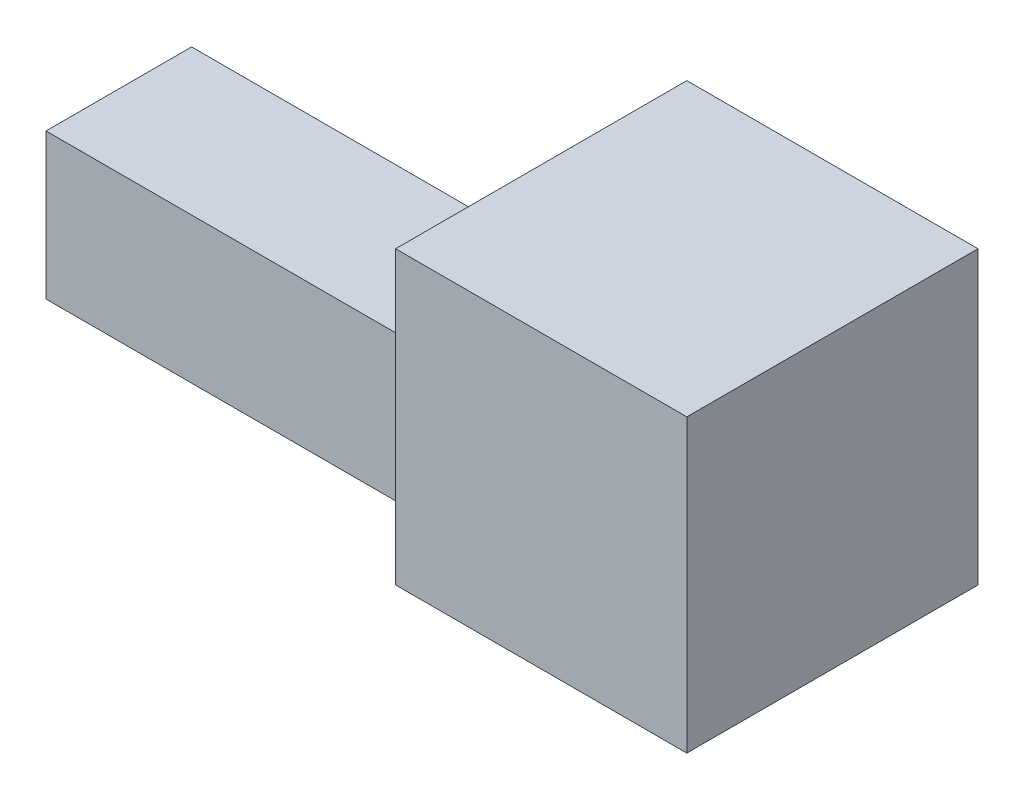
ISO-10303-21;
HEADER;
FILE_DESCRIPTION(('STEP AP214'),'2;1');
FILE_NAME('part.step','',(''),(''),'','','');
FILE_SCHEMA(('AUTOMOTIVE_DESIGN { 1 0 10303 214 1 1 1 1 }'));
ENDSEC;
DATA;
#1=APPLICATION_CONTEXT('core data for automotive mechanical design processes');
#2=APPLICATION_PROTOCOL_DEFINITION('international standard','automotive_design',2000,#1);
#3=PRODUCT_CONTEXT('',#1,'mechanical');
#4=PRODUCT('Part','Part','',(#3));
#5=PRODUCT_RELATED_PRODUCT_CATEGORY('part','',(#4));
#6=PRODUCT_DEFINITION_FORMATION('','',#4);
#7=PRODUCT_DEFINITION_CONTEXT('part definition',#1,'design');
#8=PRODUCT_DEFINITION('design','',#6,#7);
#9=PRODUCT_DEFINITION_SHAPE('','',#8);
#10=(LENGTH_UNIT() NAMED_UNIT(*) SI_UNIT(.MILLI.,.METRE.));
#11=(NAMED_UNIT(*) PLANE_ANGLE_UNIT() SI_UNIT($,.RADIAN.));
#12=(NAMED_UNIT(*) SI_UNIT($,.STERADIAN.) SOLID_ANGLE_UNIT());
#13=UNCERTAINTY_MEASURE_WITH_UNIT(LENGTH_MEASURE(1.E-05),#10,'distance_accuracy_value','');
#14=(GEOMETRIC_REPRESENTATION_CONTEXT(3) GLOBAL_UNCERTAINTY_ASSIGNED_CONTEXT((#13)) GLOBAL_UNIT_ASSIGNED_CONTEXT((#10,
#11,#12)) REPRESENTATION_CONTEXT('',''));
#15=CARTESIAN_POINT('',(0.,0.,0.));
#16=DIRECTION('',(0.,0.,1.));
#17=DIRECTION('',(1.,0.,0.));
#18=AXIS2_PLACEMENT_3D('',#15,#16,#17);
#19=CARTESIAN_POINT('',(-15.,10.,5.));
#20=DIRECTION('',(1.,0.,0.));
#21=DIRECTION('',(0.,0.,-1.));
#22=AXIS2_PLACEMENT_3D('',#19,#20,#21);
#23=PLANE('',#22);
#24=DIRECTION('',(0.,0.,1.));
#25=VECTOR('',#24,1.);
#26=CARTESIAN_POINT('',(-15.,0.,5.));
#27=LINE('',#26,#25);
#28=CARTESIAN_POINT('',(-15.,0.,-5.));
#29=VERTEX_POINT('',#28);
#30=CARTESIAN_POINT('',(-15.,0.,5.));
#31=VERTEX_POINT('',#30);
#32=EDGE_CURVE('E106',#29,#31,#27,.T.);
#33=ORIENTED_EDGE('',*,*,#32,.T.);
#34=DIRECTION('',(0.,-1.,0.));
#35=VECTOR('',#34,1.);
#36=CARTESIAN_POINT('',(-15.,10.,5.));
#37=LINE('',#36,#35);
#38=CARTESIAN_POINT('',(-15.,10.,5.));
#39=VERTEX_POINT('',#38);
#40=EDGE_CURVE('E12',#39,#31,#37,.T.);
#41=ORIENTED_EDGE('',*,*,#40,.F.);
#42=DIRECTION('',(0.,0.,1.));
#43=VECTOR('',#42,1.);
#44=CARTESIAN_POINT('',(-15.,10.,5.));
#45=LINE('',#44,#43);
#46=CARTESIAN_POINT('',(-15.,10.,-5.));
#47=VERTEX_POINT('',#46);
#48=EDGE_CURVE('E94',#47,#39,#45,.T.);
#49=ORIENTED_EDGE('',*,*,#48,.F.);
#50=DIRECTION('',(0.,-1.,0.));
#51=VECTOR('',#50,1.);
#52=CARTESIAN_POINT('',(-15.,10.,-5.));
#53=LINE('',#52,#51);
#54=EDGE_CURVE('E102',#47,#29,#53,.T.);
#55=ORIENTED_EDGE('',*,*,#54,.T.);
#56=EDGE_LOOP('',(#33,#41,#49,#55));
#57=FACE_BOUND('',#56,.T.);
#58=ADVANCED_FACE('F43',(#57),#23,.F.);
#59=CARTESIAN_POINT('',(15.,10.,5.));
#60=DIRECTION('',(0.,0.,-1.));
#61=DIRECTION('',(-1.,0.,0.));
#62=AXIS2_PLACEMENT_3D('',#59,#60,#61);
#63=PLANE('',#62);
#64=DIRECTION('',(1.,0.,0.));
#65=VECTOR('',#64,1.);
#66=CARTESIAN_POINT('',(15.,0.,5.));
#67=LINE('',#66,#65);
#68=CARTESIAN_POINT('',(15.,0.,5.));
#69=VERTEX_POINT('',#68);
#70=EDGE_CURVE('E98',#31,#69,#67,.T.);
#71=ORIENTED_EDGE('',*,*,#70,.T.);
#72=DIRECTION('',(0.,-1.,0.));
#73=VECTOR('',#72,1.);
#74=CARTESIAN_POINT('',(15.,10.,5.));
#75=LINE('',#74,#73);
#76=CARTESIAN_POINT('',(15.,10.,5.));
#77=VERTEX_POINT('',#76);
#78=EDGE_CURVE('E51',#77,#69,#75,.T.);
#79=ORIENTED_EDGE('',*,*,#78,.F.);
#80=DIRECTION('',(1.,0.,0.));
#81=VECTOR('',#80,1.);
#82=CARTESIAN_POINT('',(15.,10.,5.));
#83=LINE('',#82,#81);
#84=EDGE_CURVE('E89',#39,#77,#83,.T.);
#85=ORIENTED_EDGE('',*,*,#84,.F.);
#86=ORIENTED_EDGE('',*,*,#40,.T.);
#87=EDGE_LOOP('',(#71,#79,#85,#86));
#88=FACE_BOUND('',#87,.T.);
#89=ADVANCED_FACE('F97',(#88),#63,.F.);
#90=CARTESIAN_POINT('',(15.,10.,5.));
#91=DIRECTION('',(-1.,0.,0.));
#92=DIRECTION('',(0.,0.,1.));
#93=AXIS2_PLACEMENT_3D('',#90,#91,#92);
#94=PLANE('',#93);
#95=DIRECTION('',(0.,0.,-1.));
#96=VECTOR('',#95,1.);
#97=CARTESIAN_POINT('',(15.,0.,5.));
#98=LINE('',#97,#96);
#99=CARTESIAN_POINT('',(15.,0.,-5.));
#100=VERTEX_POINT('',#99);
#101=EDGE_CURVE('E76',#69,#100,#98,.T.);
#102=ORIENTED_EDGE('',*,*,#101,.T.);
#103=DIRECTION('',(0.,-1.,0.));
#104=VECTOR('',#103,1.);
#105=CARTESIAN_POINT('',(15.,10.,-5.));
#106=LINE('',#105,#104);
#107=CARTESIAN_POINT('',(15.,10.,-5.));
#108=VERTEX_POINT('',#107);
#109=EDGE_CURVE('E99',#108,#100,#106,.T.);
#110=ORIENTED_EDGE('',*,*,#109,.F.);
#111=DIRECTION('',(0.,0.,-1.));
#112=VECTOR('',#111,1.);
#113=CARTESIAN_POINT('',(15.,10.,5.));
#114=LINE('',#113,#112);
#115=EDGE_CURVE('E92',#77,#108,#114,.T.);
#116=ORIENTED_EDGE('',*,*,#115,.F.);
#117=ORIENTED_EDGE('',*,*,#78,.T.);
#118=EDGE_LOOP('',(#102,#110,#116,#117));
#119=FACE_BOUND('',#118,.T.);
#120=ADVANCED_FACE('F100',(#119),#94,.F.);
#121=CARTESIAN_POINT('',(15.,10.,-5.));
#122=DIRECTION('',(0.,0.,1.));
#123=DIRECTION('',(1.,0.,0.));
#124=AXIS2_PLACEMENT_3D('',#121,#122,#123);
#125=PLANE('',#124);
#126=DIRECTION('',(-1.,0.,0.));
#127=VECTOR('',#126,1.);
#128=CARTESIAN_POINT('',(15.,0.,-5.));
#129=LINE('',#128,#127);
#130=EDGE_CURVE('E82',#100,#29,#129,.T.);
#131=ORIENTED_EDGE('',*,*,#130,.T.);
#132=ORIENTED_EDGE('',*,*,#54,.F.);
#133=DIRECTION('',(-1.,0.,0.));
#134=VECTOR('',#133,1.);
#135=CARTESIAN_POINT('',(15.,10.,-5.));
#136=LINE('',#135,#134);
#137=EDGE_CURVE('E59',#108,#47,#136,.T.);
#138=ORIENTED_EDGE('',*,*,#137,.F.);
#139=ORIENTED_EDGE('',*,*,#109,.T.);
#140=EDGE_LOOP('',(#131,#132,#138,#139));
#141=FACE_BOUND('',#140,.T.);
#142=ADVANCED_FACE('F113',(#141),#125,.F.);
#143=CARTESIAN_POINT('',(0.,10.,0.));
#144=DIRECTION('',(0.,1.,0.));
#145=DIRECTION('',(0.,0.,1.));
#146=AXIS2_PLACEMENT_3D('',#143,#144,#145);
#147=PLANE('',#146);
#148=ORIENTED_EDGE('',*,*,#48,.T.);
#149=ORIENTED_EDGE('',*,*,#84,.T.);
#150=ORIENTED_EDGE('',*,*,#115,.T.);
#151=ORIENTED_EDGE('',*,*,#137,.T.);
#152=EDGE_LOOP('',(#148,#149,#150,#151));
#153=FACE_BOUND('',#152,.T.);
#154=ADVANCED_FACE('F90',(#153),#147,.T.);
#155=CARTESIAN_POINT('',(0.,0.,0.));
#156=DIRECTION('',(0.,1.,0.));
#157=DIRECTION('',(0.,0.,1.));
#158=AXIS2_PLACEMENT_3D('',#155,#156,#157);
#159=PLANE('',#158);
#160=ORIENTED_EDGE('',*,*,#32,.F.);
#161=ORIENTED_EDGE('',*,*,#130,.F.);
#162=ORIENTED_EDGE('',*,*,#101,.F.);
#163=ORIENTED_EDGE('',*,*,#70,.F.);
#164=EDGE_LOOP('',(#160,#161,#162,#163));
#165=FACE_BOUND('',#164,.T.);
#166=ADVANCED_FACE('F116',(#165),#159,.F.);
#167=CLOSED_SHELL('',(#58,#89,#120,#142,#154,#166));
#168=MANIFOLD_SOLID_BREP('B2',#167);
#169=CARTESIAN_POINT('',(14.0141331780137,20.,10.));
#170=DIRECTION('',(1.,0.,0.));
#171=DIRECTION('',(0.,0.,-1.));
#172=AXIS2_PLACEMENT_3D('',#169,#170,#171);
#173=PLANE('',#172);
#174=DIRECTION('',(0.,0.,1.));
#175=VECTOR('',#174,1.);
#176=CARTESIAN_POINT('',(14.0141331780137,0.,10.));
#177=LINE('',#176,#175);
#178=CARTESIAN_POINT('',(14.0141331780137,0.,-10.));
#179=VERTEX_POINT('',#178);
#180=CARTESIAN_POINT('',(14.0141331780137,0.,10.));
#181=VERTEX_POINT('',#180);
#182=EDGE_CURVE('E230',#179,#181,#177,.T.);
#183=ORIENTED_EDGE('',*,*,#182,.T.);
#184=DIRECTION('',(0.,-1.,0.));
#185=VECTOR('',#184,1.);
#186=CARTESIAN_POINT('',(14.0141331780137,20.,10.));
#187=LINE('',#186,#185);
#188=CARTESIAN_POINT('',(14.0141331780137,20.,10.));
#189=VERTEX_POINT('',#188);
#190=EDGE_CURVE('E41',#189,#181,#187,.T.);
#191=ORIENTED_EDGE('',*,*,#190,.F.);
#192=DIRECTION('',(0.,0.,1.));
#193=VECTOR('',#192,1.);
#194=CARTESIAN_POINT('',(14.0141331780137,20.,10.));
#195=LINE('',#194,#193);
#196=CARTESIAN_POINT('',(14.0141331780137,20.,-10.));
#197=VERTEX_POINT('',#196);
#198=EDGE_CURVE('E218',#197,#189,#195,.T.);
#199=ORIENTED_EDGE('',*,*,#198,.F.);
#200=DIRECTION('',(0.,-1.,0.));
#201=VECTOR('',#200,1.);
#202=CARTESIAN_POINT('',(14.0141331780137,20.,-10.));
#203=LINE('',#202,#201);
#204=EDGE_CURVE('E226',#197,#179,#203,.T.);
#205=ORIENTED_EDGE('',*,*,#204,.T.);
#206=EDGE_LOOP('',(#183,#191,#199,#205));
#207=FACE_BOUND('',#206,.T.);
#208=ADVANCED_FACE('F167',(#207),#173,.F.);
#209=CARTESIAN_POINT('',(34.0141331780137,20.,10.));
#210=DIRECTION('',(0.,0.,-1.));
#211=DIRECTION('',(-1.,0.,0.));
#212=AXIS2_PLACEMENT_3D('',#209,#210,#211);
#213=PLANE('',#212);
#214=DIRECTION('',(1.,0.,0.));
#215=VECTOR('',#214,1.);
#216=CARTESIAN_POINT('',(34.0141331780137,0.,10.));
#217=LINE('',#216,#215);
#218=CARTESIAN_POINT('',(34.0141331780137,0.,10.));
#219=VERTEX_POINT('',#218);
#220=EDGE_CURVE('E222',#181,#219,#217,.T.);
#221=ORIENTED_EDGE('',*,*,#220,.T.);
#222=DIRECTION('',(0.,-1.,0.));
#223=VECTOR('',#222,1.);
#224=CARTESIAN_POINT('',(34.0141331780137,20.,10.));
#225=LINE('',#224,#223);
#226=CARTESIAN_POINT('',(34.0141331780137,20.,10.));
#227=VERTEX_POINT('',#226);
#228=EDGE_CURVE('E175',#227,#219,#225,.T.);
#229=ORIENTED_EDGE('',*,*,#228,.F.);
#230=DIRECTION('',(1.,0.,0.));
#231=VECTOR('',#230,1.);
#232=CARTESIAN_POINT('',(34.0141331780137,20.,10.));
#233=LINE('',#232,#231);
#234=EDGE_CURVE('E213',#189,#227,#233,.T.);
#235=ORIENTED_EDGE('',*,*,#234,.F.);
#236=ORIENTED_EDGE('',*,*,#190,.T.);
#237=EDGE_LOOP('',(#221,#229,#235,#236));
#238=FACE_BOUND('',#237,.T.);
#239=ADVANCED_FACE('F221',(#238),#213,.F.);
#240=CARTESIAN_POINT('',(34.0141331780137,20.,10.));
#241=DIRECTION('',(-1.,0.,0.));
#242=DIRECTION('',(0.,0.,1.));
#243=AXIS2_PLACEMENT_3D('',#240,#241,#242);
#244=PLANE('',#243);
#245=DIRECTION('',(0.,0.,-1.));
#246=VECTOR('',#245,1.);
#247=CARTESIAN_POINT('',(34.0141331780137,0.,10.));
#248=LINE('',#247,#246);
#249=CARTESIAN_POINT('',(34.0141331780137,0.,-10.));
#250=VERTEX_POINT('',#249);
#251=EDGE_CURVE('E200',#219,#250,#248,.T.);
#252=ORIENTED_EDGE('',*,*,#251,.T.);
#253=DIRECTION('',(0.,-1.,0.));
#254=VECTOR('',#253,1.);
#255=CARTESIAN_POINT('',(34.0141331780137,20.,-10.));
#256=LINE('',#255,#254);
#257=CARTESIAN_POINT('',(34.0141331780137,20.,-10.));
#258=VERTEX_POINT('',#257);
#259=EDGE_CURVE('E223',#258,#250,#256,.T.);
#260=ORIENTED_EDGE('',*,*,#259,.F.);
#261=DIRECTION('',(0.,0.,-1.));
#262=VECTOR('',#261,1.);
#263=CARTESIAN_POINT('',(34.0141331780137,20.,10.));
#264=LINE('',#263,#262);
#265=EDGE_CURVE('E216',#227,#258,#264,.T.);
#266=ORIENTED_EDGE('',*,*,#265,.F.);
#267=ORIENTED_EDGE('',*,*,#228,.T.);
#268=EDGE_LOOP('',(#252,#260,#266,#267));
#269=FACE_BOUND('',#268,.T.);
#270=ADVANCED_FACE('F224',(#269),#244,.F.);
#271=CARTESIAN_POINT('',(34.0141331780137,20.,-10.));
#272=DIRECTION('',(0.,0.,1.));
#273=DIRECTION('',(1.,0.,0.));
#274=AXIS2_PLACEMENT_3D('',#271,#272,#273);
#275=PLANE('',#274);
#276=DIRECTION('',(-1.,0.,0.));
#277=VECTOR('',#276,1.);
#278=CARTESIAN_POINT('',(34.0141331780137,0.,-10.));
#279=LINE('',#278,#277);
#280=EDGE_CURVE('E206',#250,#179,#279,.T.);
#281=ORIENTED_EDGE('',*,*,#280,.T.);
#282=ORIENTED_EDGE('',*,*,#204,.F.);
#283=DIRECTION('',(-1.,0.,0.));
#284=VECTOR('',#283,1.);
#285=CARTESIAN_POINT('',(34.0141331780137,20.,-10.));
#286=LINE('',#285,#284);
#287=EDGE_CURVE('E183',#258,#197,#286,.T.);
#288=ORIENTED_EDGE('',*,*,#287,.F.);
#289=ORIENTED_EDGE('',*,*,#259,.T.);
#290=EDGE_LOOP('',(#281,#282,#288,#289));
#291=FACE_BOUND('',#290,.T.);
#292=ADVANCED_FACE('F237',(#291),#275,.F.);
#293=CARTESIAN_POINT('',(0.,20.,0.));
#294=DIRECTION('',(0.,1.,0.));
#295=DIRECTION('',(0.,0.,1.));
#296=AXIS2_PLACEMENT_3D('',#293,#294,#295);
#297=PLANE('',#296);
#298=ORIENTED_EDGE('',*,*,#198,.T.);
#299=ORIENTED_EDGE('',*,*,#234,.T.);
#300=ORIENTED_EDGE('',*,*,#265,.T.);
#301=ORIENTED_EDGE('',*,*,#287,.T.);
#302=EDGE_LOOP('',(#298,#299,#300,#301));
#303=FACE_BOUND('',#302,.T.);
#304=ADVANCED_FACE('F214',(#303),#297,.T.);
#305=CARTESIAN_POINT('',(0.,0.,0.));
#306=DIRECTION('',(0.,1.,0.));
#307=DIRECTION('',(0.,0.,1.));
#308=AXIS2_PLACEMENT_3D('',#305,#306,#307);
#309=PLANE('',#308);
#310=ORIENTED_EDGE('',*,*,#182,.F.);
#311=ORIENTED_EDGE('',*,*,#280,.F.);
#312=ORIENTED_EDGE('',*,*,#251,.F.);
#313=ORIENTED_EDGE('',*,*,#220,.F.);
#314=EDGE_LOOP('',(#310,#311,#312,#313));
#315=FACE_BOUND('',#314,.T.);
#316=ADVANCED_FACE('F240',(#315),#309,.F.);
#317=CLOSED_SHELL('',(#208,#239,#270,#292,#304,#316));
#318=MANIFOLD_SOLID_BREP('B6',#317);
#319=ADVANCED_BREP_SHAPE_REPRESENTATION('',(#18,#168,#318),#14);
#320=SHAPE_DEFINITION_REPRESENTATION(#9,#319);
ENDSEC;
END-ISO-10303-21;
